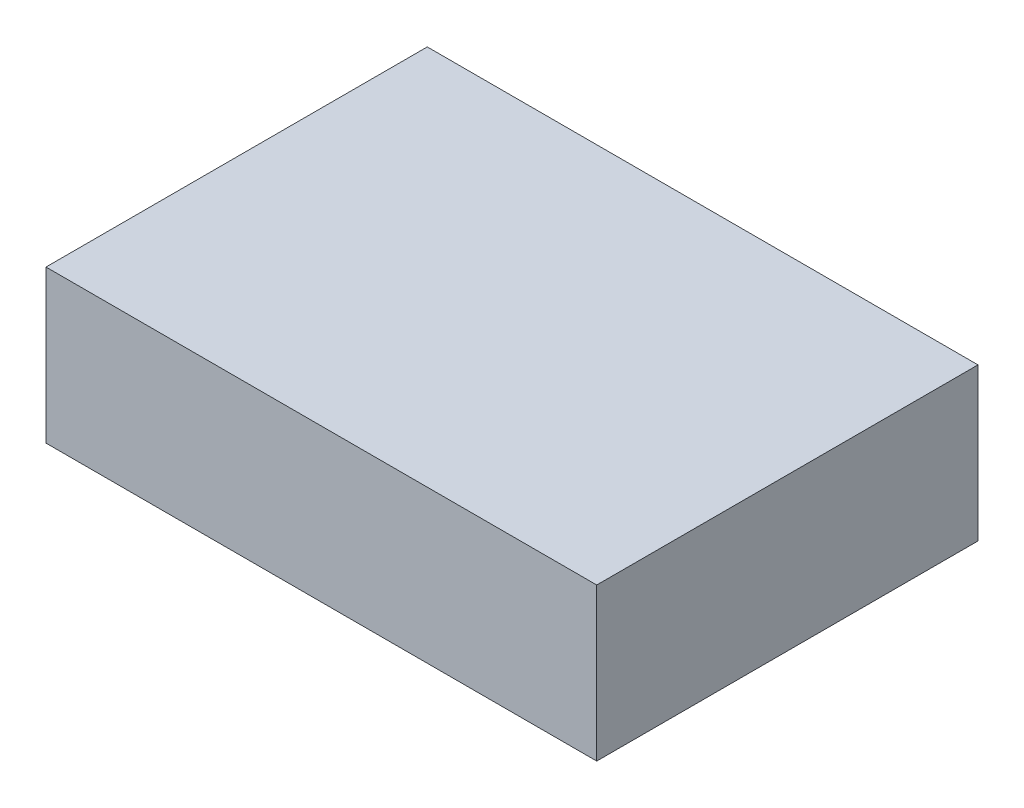
ISO-10303-21;
HEADER;
FILE_DESCRIPTION(('STEP AP214'),'2;1');
FILE_NAME('part.step','',(''),(''),'','','');
FILE_SCHEMA(('AUTOMOTIVE_DESIGN { 1 0 10303 214 1 1 1 1 }'));
ENDSEC;
DATA;
#1=APPLICATION_CONTEXT('core data for automotive mechanical design processes');
#2=APPLICATION_PROTOCOL_DEFINITION('international standard','automotive_design',2000,#1);
#3=PRODUCT_CONTEXT('',#1,'mechanical');
#4=PRODUCT('Part','Part','',(#3));
#5=PRODUCT_RELATED_PRODUCT_CATEGORY('part','',(#4));
#6=PRODUCT_DEFINITION_FORMATION('','',#4);
#7=PRODUCT_DEFINITION_CONTEXT('part definition',#1,'design');
#8=PRODUCT_DEFINITION('design','',#6,#7);
#9=PRODUCT_DEFINITION_SHAPE('','',#8);
#10=(LENGTH_UNIT() NAMED_UNIT(*) SI_UNIT(.MILLI.,.METRE.));
#11=(NAMED_UNIT(*) PLANE_ANGLE_UNIT() SI_UNIT($,.RADIAN.));
#12=(NAMED_UNIT(*) SI_UNIT($,.STERADIAN.) SOLID_ANGLE_UNIT());
#13=UNCERTAINTY_MEASURE_WITH_UNIT(LENGTH_MEASURE(1.E-05),#10,'distance_accuracy_value','');
#14=(GEOMETRIC_REPRESENTATION_CONTEXT(3) GLOBAL_UNCERTAINTY_ASSIGNED_CONTEXT((#13)) GLOBAL_UNIT_ASSIGNED_CONTEXT((#10,
#11,#12)) REPRESENTATION_CONTEXT('',''));
#15=CARTESIAN_POINT('',(0.,0.,0.));
#16=DIRECTION('',(0.,0.,1.));
#17=DIRECTION('',(1.,0.,0.));
#18=AXIS2_PLACEMENT_3D('',#15,#16,#17);
#19=CARTESIAN_POINT('',(16.51,9.144,11.43));
#20=DIRECTION('',(-1.,0.,0.));
#21=DIRECTION('',(0.,0.,1.));
#22=AXIS2_PLACEMENT_3D('',#19,#20,#21);
#23=PLANE('',#22);
#24=DIRECTION('',(0.,0.,-1.));
#25=VECTOR('',#24,1.);
#26=CARTESIAN_POINT('',(16.51,0.,11.43));
#27=LINE('',#26,#25);
#28=CARTESIAN_POINT('',(16.51,0.,11.43));
#29=VERTEX_POINT('',#28);
#30=CARTESIAN_POINT('',(16.51,0.,-11.43));
#31=VERTEX_POINT('',#30);
#32=EDGE_CURVE('E96',#29,#31,#27,.T.);
#33=ORIENTED_EDGE('',*,*,#32,.T.);
#34=DIRECTION('',(0.,-1.,0.));
#35=VECTOR('',#34,1.);
#36=CARTESIAN_POINT('',(16.51,9.144,-11.43));
#37=LINE('',#36,#35);
#38=CARTESIAN_POINT('',(16.51,9.144,-11.43));
#39=VERTEX_POINT('',#38);
#40=EDGE_CURVE('E11',#39,#31,#37,.T.);
#41=ORIENTED_EDGE('',*,*,#40,.F.);
#42=DIRECTION('',(0.,0.,-1.));
#43=VECTOR('',#42,1.);
#44=CARTESIAN_POINT('',(16.51,9.144,11.43));
#45=LINE('',#44,#43);
#46=CARTESIAN_POINT('',(16.51,9.144,11.43));
#47=VERTEX_POINT('',#46);
#48=EDGE_CURVE('E84',#47,#39,#45,.T.);
#49=ORIENTED_EDGE('',*,*,#48,.F.);
#50=DIRECTION('',(0.,-1.,0.));
#51=VECTOR('',#50,1.);
#52=CARTESIAN_POINT('',(16.51,9.144,11.43));
#53=LINE('',#52,#51);
#54=EDGE_CURVE('E92',#47,#29,#53,.T.);
#55=ORIENTED_EDGE('',*,*,#54,.T.);
#56=EDGE_LOOP('',(#33,#41,#49,#55));
#57=FACE_BOUND('',#56,.T.);
#58=ADVANCED_FACE('F33',(#57),#23,.F.);
#59=CARTESIAN_POINT('',(-16.51,9.144,-11.43));
#60=DIRECTION('',(0.,0.,1.));
#61=DIRECTION('',(1.,0.,0.));
#62=AXIS2_PLACEMENT_3D('',#59,#60,#61);
#63=PLANE('',#62);
#64=DIRECTION('',(-1.,0.,0.));
#65=VECTOR('',#64,1.);
#66=CARTESIAN_POINT('',(-16.51,0.,-11.43));
#67=LINE('',#66,#65);
#68=CARTESIAN_POINT('',(-16.51,0.,-11.43));
#69=VERTEX_POINT('',#68);
#70=EDGE_CURVE('E88',#31,#69,#67,.T.);
#71=ORIENTED_EDGE('',*,*,#70,.T.);
#72=DIRECTION('',(0.,-1.,0.));
#73=VECTOR('',#72,1.);
#74=CARTESIAN_POINT('',(-16.51,9.144,-11.43));
#75=LINE('',#74,#73);
#76=CARTESIAN_POINT('',(-16.51,9.144,-11.43));
#77=VERTEX_POINT('',#76);
#78=EDGE_CURVE('E41',#77,#69,#75,.T.);
#79=ORIENTED_EDGE('',*,*,#78,.F.);
#80=DIRECTION('',(-1.,0.,0.));
#81=VECTOR('',#80,1.);
#82=CARTESIAN_POINT('',(-16.51,9.144,-11.43));
#83=LINE('',#82,#81);
#84=EDGE_CURVE('E79',#39,#77,#83,.T.);
#85=ORIENTED_EDGE('',*,*,#84,.F.);
#86=ORIENTED_EDGE('',*,*,#40,.T.);
#87=EDGE_LOOP('',(#71,#79,#85,#86));
#88=FACE_BOUND('',#87,.T.);
#89=ADVANCED_FACE('F87',(#88),#63,.F.);
#90=CARTESIAN_POINT('',(-16.51,9.144,11.43));
#91=DIRECTION('',(1.,0.,0.));
#92=DIRECTION('',(0.,0.,-1.));
#93=AXIS2_PLACEMENT_3D('',#90,#91,#92);
#94=PLANE('',#93);
#95=DIRECTION('',(0.,0.,1.));
#96=VECTOR('',#95,1.);
#97=CARTESIAN_POINT('',(-16.51,0.,11.43));
#98=LINE('',#97,#96);
#99=CARTESIAN_POINT('',(-16.51,0.,11.43));
#100=VERTEX_POINT('',#99);
#101=EDGE_CURVE('E66',#69,#100,#98,.T.);
#102=ORIENTED_EDGE('',*,*,#101,.T.);
#103=DIRECTION('',(0.,-1.,0.));
#104=VECTOR('',#103,1.);
#105=CARTESIAN_POINT('',(-16.51,9.144,11.43));
#106=LINE('',#105,#104);
#107=CARTESIAN_POINT('',(-16.51,9.144,11.43));
#108=VERTEX_POINT('',#107);
#109=EDGE_CURVE('E89',#108,#100,#106,.T.);
#110=ORIENTED_EDGE('',*,*,#109,.F.);
#111=DIRECTION('',(0.,0.,1.));
#112=VECTOR('',#111,1.);
#113=CARTESIAN_POINT('',(-16.51,9.144,11.43));
#114=LINE('',#113,#112);
#115=EDGE_CURVE('E82',#77,#108,#114,.T.);
#116=ORIENTED_EDGE('',*,*,#115,.F.);
#117=ORIENTED_EDGE('',*,*,#78,.T.);
#118=EDGE_LOOP('',(#102,#110,#116,#117));
#119=FACE_BOUND('',#118,.T.);
#120=ADVANCED_FACE('F90',(#119),#94,.F.);
#121=CARTESIAN_POINT('',(-16.51,9.144,11.43));
#122=DIRECTION('',(0.,0.,-1.));
#123=DIRECTION('',(-1.,0.,0.));
#124=AXIS2_PLACEMENT_3D('',#121,#122,#123);
#125=PLANE('',#124);
#126=DIRECTION('',(1.,0.,0.));
#127=VECTOR('',#126,1.);
#128=CARTESIAN_POINT('',(-16.51,0.,11.43));
#129=LINE('',#128,#127);
#130=EDGE_CURVE('E72',#100,#29,#129,.T.);
#131=ORIENTED_EDGE('',*,*,#130,.T.);
#132=ORIENTED_EDGE('',*,*,#54,.F.);
#133=DIRECTION('',(1.,0.,0.));
#134=VECTOR('',#133,1.);
#135=CARTESIAN_POINT('',(-16.51,9.144,11.43));
#136=LINE('',#135,#134);
#137=EDGE_CURVE('E49',#108,#47,#136,.T.);
#138=ORIENTED_EDGE('',*,*,#137,.F.);
#139=ORIENTED_EDGE('',*,*,#109,.T.);
#140=EDGE_LOOP('',(#131,#132,#138,#139));
#141=FACE_BOUND('',#140,.T.);
#142=ADVANCED_FACE('F103',(#141),#125,.F.);
#143=CARTESIAN_POINT('',(0.,9.144,0.));
#144=DIRECTION('',(0.,-1.,0.));
#145=DIRECTION('',(0.,0.,-1.));
#146=AXIS2_PLACEMENT_3D('',#143,#144,#145);
#147=PLANE('',#146);
#148=ORIENTED_EDGE('',*,*,#48,.T.);
#149=ORIENTED_EDGE('',*,*,#84,.T.);
#150=ORIENTED_EDGE('',*,*,#115,.T.);
#151=ORIENTED_EDGE('',*,*,#137,.T.);
#152=EDGE_LOOP('',(#148,#149,#150,#151));
#153=FACE_BOUND('',#152,.T.);
#154=ADVANCED_FACE('F80',(#153),#147,.F.);
#155=CARTESIAN_POINT('',(0.,0.,0.));
#156=DIRECTION('',(0.,-1.,0.));
#157=DIRECTION('',(0.,0.,-1.));
#158=AXIS2_PLACEMENT_3D('',#155,#156,#157);
#159=PLANE('',#158);
#160=ORIENTED_EDGE('',*,*,#32,.F.);
#161=ORIENTED_EDGE('',*,*,#130,.F.);
#162=ORIENTED_EDGE('',*,*,#101,.F.);
#163=ORIENTED_EDGE('',*,*,#70,.F.);
#164=EDGE_LOOP('',(#160,#161,#162,#163));
#165=FACE_BOUND('',#164,.T.);
#166=ADVANCED_FACE('F106',(#165),#159,.T.);
#167=CLOSED_SHELL('',(#58,#89,#120,#142,#154,#166));
#168=MANIFOLD_SOLID_BREP('B2',#167);
#169=ADVANCED_BREP_SHAPE_REPRESENTATION('',(#18,#168),#14);
#170=SHAPE_DEFINITION_REPRESENTATION(#9,#169);
ENDSEC;
END-ISO-10303-21;
